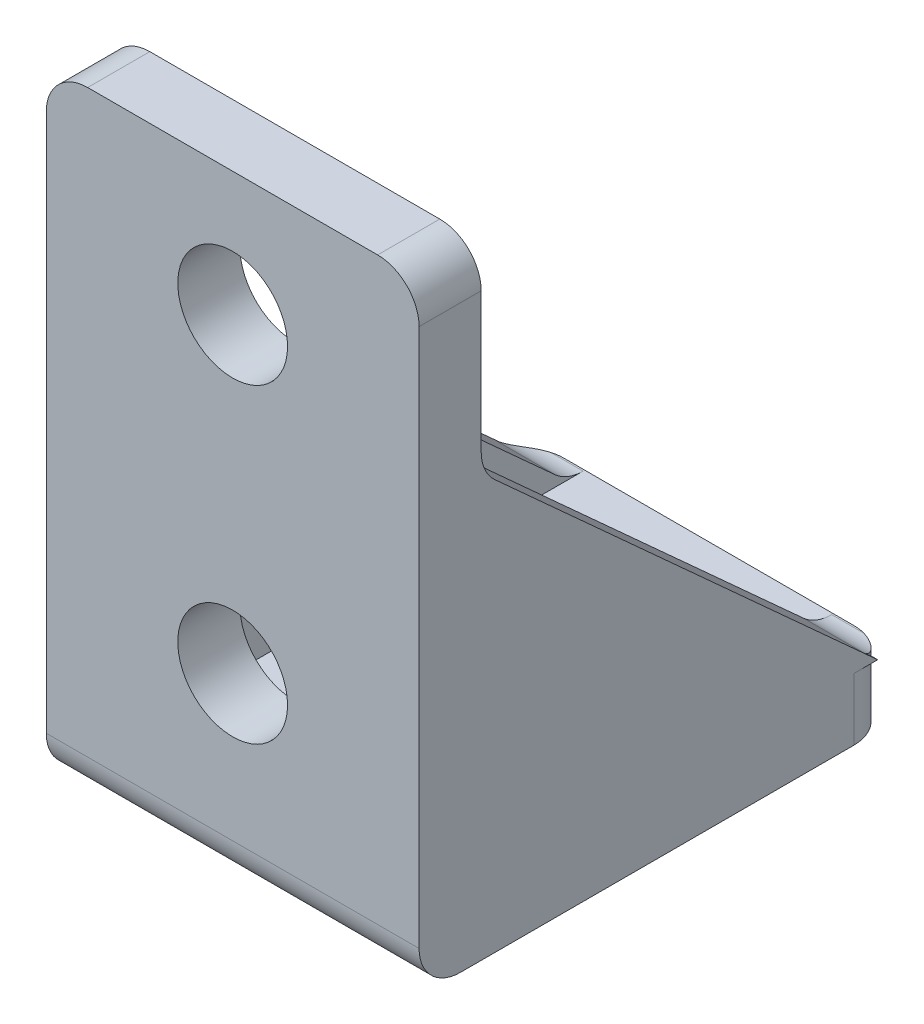
ISO-10303-21;
HEADER;
FILE_DESCRIPTION(('STEP AP214'),'2;1');
FILE_NAME('part.step','',(''),(''),'','','');
FILE_SCHEMA(('AUTOMOTIVE_DESIGN { 1 0 10303 214 1 1 1 1 }'));
ENDSEC;
DATA;
#1=APPLICATION_CONTEXT('core data for automotive mechanical design processes');
#2=APPLICATION_PROTOCOL_DEFINITION('international standard','automotive_design',2000,#1);
#3=PRODUCT_CONTEXT('',#1,'mechanical');
#4=PRODUCT('Part','Part','',(#3));
#5=PRODUCT_RELATED_PRODUCT_CATEGORY('part','',(#4));
#6=PRODUCT_DEFINITION_FORMATION('','',#4);
#7=PRODUCT_DEFINITION_CONTEXT('part definition',#1,'design');
#8=PRODUCT_DEFINITION('design','',#6,#7);
#9=PRODUCT_DEFINITION_SHAPE('','',#8);
#10=(LENGTH_UNIT() NAMED_UNIT(*) SI_UNIT(.MILLI.,.METRE.));
#11=(NAMED_UNIT(*) PLANE_ANGLE_UNIT() SI_UNIT($,.RADIAN.));
#12=(NAMED_UNIT(*) SI_UNIT($,.STERADIAN.) SOLID_ANGLE_UNIT());
#13=UNCERTAINTY_MEASURE_WITH_UNIT(LENGTH_MEASURE(1.E-05),#10,'distance_accuracy_value','');
#14=(GEOMETRIC_REPRESENTATION_CONTEXT(3) GLOBAL_UNCERTAINTY_ASSIGNED_CONTEXT((#13)) GLOBAL_UNIT_ASSIGNED_CONTEXT((#10,
#11,#12)) REPRESENTATION_CONTEXT('',''));
#15=CARTESIAN_POINT('',(0.,0.,0.));
#16=DIRECTION('',(0.,0.,1.));
#17=DIRECTION('',(1.,0.,0.));
#18=AXIS2_PLACEMENT_3D('',#15,#16,#17);
#19=CARTESIAN_POINT('',(0.,0.,0.));
#20=DIRECTION('',(0.,0.,1.));
#21=DIRECTION('',(1.,0.,0.));
#22=AXIS2_PLACEMENT_3D('',#19,#20,#21);
#23=PLANE('',#22);
#24=CARTESIAN_POINT('',(9.,-21.,0.));
#25=DIRECTION('',(0.,0.,1.));
#26=DIRECTION('',(1.,0.,0.));
#27=AXIS2_PLACEMENT_3D('',#24,#25,#26);
#28=CIRCLE('',#27,2.65);
#29=CARTESIAN_POINT('',(11.65,-21.,0.));
#30=VERTEX_POINT('',#29);
#31=EDGE_CURVE('E288',#30,#30,#28,.T.);
#32=ORIENTED_EDGE('',*,*,#31,.T.);
#33=EDGE_LOOP('',(#32));
#34=FACE_BOUND('',#33,.T.);
#35=CARTESIAN_POINT('',(9.,-6.,0.));
#36=DIRECTION('',(0.,0.,1.));
#37=DIRECTION('',(1.,0.,0.));
#38=AXIS2_PLACEMENT_3D('',#35,#36,#37);
#39=CIRCLE('',#38,2.65);
#40=CARTESIAN_POINT('',(11.65,-6.,0.));
#41=VERTEX_POINT('',#40);
#42=EDGE_CURVE('E295',#41,#41,#39,.T.);
#43=ORIENTED_EDGE('',*,*,#42,.T.);
#44=EDGE_LOOP('',(#43));
#45=FACE_BOUND('',#44,.T.);
#46=DIRECTION('',(0.,1.,0.));
#47=VECTOR('',#46,1.);
#48=CARTESIAN_POINT('',(3.,-9.62851294118363,0.));
#49=LINE('',#48,#47);
#50=CARTESIAN_POINT('',(3.,-27.,0.));
#51=VERTEX_POINT('',#50);
#52=CARTESIAN_POINT('',(3.,-8.74260656438226,0.));
#53=VERTEX_POINT('',#52);
#54=EDGE_CURVE('E65',#51,#53,#49,.T.);
#55=ORIENTED_EDGE('',*,*,#54,.T.);
#56=DIRECTION('',(-1.,0.,0.));
#57=VECTOR('',#56,1.);
#58=CARTESIAN_POINT('',(0.,-8.74260656438226,0.));
#59=LINE('',#58,#57);
#60=CARTESIAN_POINT('',(0.,-8.74260656438226,0.));
#61=VERTEX_POINT('',#60);
#62=EDGE_CURVE('E392',#53,#61,#59,.T.);
#63=ORIENTED_EDGE('',*,*,#62,.T.);
#64=DIRECTION('',(0.,-1.,0.));
#65=VECTOR('',#64,1.);
#66=CARTESIAN_POINT('',(0.,0.,0.));
#67=LINE('',#66,#65);
#68=CARTESIAN_POINT('',(0.,-2.,0.));
#69=VERTEX_POINT('',#68);
#70=EDGE_CURVE('E302',#69,#61,#67,.T.);
#71=ORIENTED_EDGE('',*,*,#70,.F.);
#72=CARTESIAN_POINT('',(2.,-2.,0.));
#73=DIRECTION('',(0.,0.,1.));
#74=DIRECTION('',(1.,0.,0.));
#75=AXIS2_PLACEMENT_3D('',#72,#73,#74);
#76=CIRCLE('',#75,2.);
#77=CARTESIAN_POINT('',(2.,0.,0.));
#78=VERTEX_POINT('',#77);
#79=EDGE_CURVE('E355',#69,#78,#76,.F.);
#80=ORIENTED_EDGE('',*,*,#79,.T.);
#81=DIRECTION('',(-1.,0.,0.));
#82=VECTOR('',#81,1.);
#83=CARTESIAN_POINT('',(0.,0.,0.));
#84=LINE('',#83,#82);
#85=CARTESIAN_POINT('',(16.,0.,0.));
#86=VERTEX_POINT('',#85);
#87=EDGE_CURVE('E306',#86,#78,#84,.T.);
#88=ORIENTED_EDGE('',*,*,#87,.F.);
#89=CARTESIAN_POINT('',(16.,-2.,0.));
#90=DIRECTION('',(0.,0.,1.));
#91=DIRECTION('',(1.,0.,0.));
#92=AXIS2_PLACEMENT_3D('',#89,#90,#91);
#93=CIRCLE('',#92,2.);
#94=CARTESIAN_POINT('',(18.,-2.,0.));
#95=VERTEX_POINT('',#94);
#96=EDGE_CURVE('E347',#86,#95,#93,.F.);
#97=ORIENTED_EDGE('',*,*,#96,.T.);
#98=DIRECTION('',(0.,1.,0.));
#99=VECTOR('',#98,1.);
#100=CARTESIAN_POINT('',(18.,0.,0.));
#101=LINE('',#100,#99);
#102=CARTESIAN_POINT('',(18.,-8.74260656438226,0.));
#103=VERTEX_POINT('',#102);
#104=EDGE_CURVE('E316',#103,#95,#101,.T.);
#105=ORIENTED_EDGE('',*,*,#104,.F.);
#106=DIRECTION('',(1.,0.,0.));
#107=VECTOR('',#106,1.);
#108=CARTESIAN_POINT('',(0.,-8.74260656438226,0.));
#109=LINE('',#108,#107);
#110=CARTESIAN_POINT('',(15.,-8.74260656438227,0.));
#111=VERTEX_POINT('',#110);
#112=EDGE_CURVE('E388',#103,#111,#109,.F.);
#113=ORIENTED_EDGE('',*,*,#112,.T.);
#114=DIRECTION('',(0.,-1.,0.));
#115=VECTOR('',#114,1.);
#116=CARTESIAN_POINT('',(15.,-27.,0.));
#117=LINE('',#116,#115);
#118=CARTESIAN_POINT('',(15.,-27.,0.));
#119=VERTEX_POINT('',#118);
#120=EDGE_CURVE('E228',#111,#119,#117,.T.);
#121=ORIENTED_EDGE('',*,*,#120,.T.);
#122=DIRECTION('',(-1.,0.,0.));
#123=VECTOR('',#122,1.);
#124=CARTESIAN_POINT('',(0.,-27.,0.));
#125=LINE('',#124,#123);
#126=EDGE_CURVE('E290',#119,#51,#125,.T.);
#127=ORIENTED_EDGE('',*,*,#126,.T.);
#128=EDGE_LOOP('',(#55,#63,#71,#80,#88,#97,#105,#113,#121,#127));
#129=FACE_BOUND('',#128,.T.);
#130=ADVANCED_FACE('F39',(#34,#45,#129),#23,.F.);
#131=CARTESIAN_POINT('',(0.,-27.,0.));
#132=DIRECTION('',(0.,-1.,0.));
#133=DIRECTION('',(0.,0.,-1.));
#134=AXIS2_PLACEMENT_3D('',#131,#132,#133);
#135=PLANE('',#134);
#136=DIRECTION('',(0.,0.,1.));
#137=VECTOR('',#136,1.);
#138=CARTESIAN_POINT('',(10.6,-27.,-6.02510414656997));
#139=LINE('',#138,#137);
#140=CARTESIAN_POINT('',(10.6,-27.,-16.02510414657));
#141=VERTEX_POINT('',#140);
#142=CARTESIAN_POINT('',(10.6,-27.,-6.02510414656997));
#143=VERTEX_POINT('',#142);
#144=EDGE_CURVE('E265',#141,#143,#139,.T.);
#145=ORIENTED_EDGE('',*,*,#144,.T.);
#146=CARTESIAN_POINT('',(8.99999999999999,-27.,-6.02510414656997));
#147=DIRECTION('',(0.,-1.,0.));
#148=DIRECTION('',(0.,0.,-1.));
#149=AXIS2_PLACEMENT_3D('',#146,#147,#148);
#150=CIRCLE('',#149,1.6);
#151=CARTESIAN_POINT('',(7.39999999999999,-27.,-6.02510414656997));
#152=VERTEX_POINT('',#151);
#153=EDGE_CURVE('E255',#143,#152,#150,.T.);
#154=ORIENTED_EDGE('',*,*,#153,.T.);
#155=DIRECTION('',(0.,0.,-1.));
#156=VECTOR('',#155,1.);
#157=CARTESIAN_POINT('',(7.39999999999999,-27.,-6.02510414656997));
#158=LINE('',#157,#156);
#159=CARTESIAN_POINT('',(7.39999999999999,-27.,-16.02510414657));
#160=VERTEX_POINT('',#159);
#161=EDGE_CURVE('E253',#152,#160,#158,.T.);
#162=ORIENTED_EDGE('',*,*,#161,.T.);
#163=CARTESIAN_POINT('',(8.99999999999998,-27.,-16.02510414657));
#164=DIRECTION('',(0.,-1.,0.));
#165=DIRECTION('',(0.,0.,-1.));
#166=AXIS2_PLACEMENT_3D('',#163,#164,#165);
#167=CIRCLE('',#166,1.6);
#168=EDGE_CURVE('E260',#160,#141,#167,.T.);
#169=ORIENTED_EDGE('',*,*,#168,.T.);
#170=EDGE_LOOP('',(#145,#154,#162,#169));
#171=FACE_BOUND('',#170,.T.);
#172=DIRECTION('',(0.,0.,-1.));
#173=VECTOR('',#172,1.);
#174=CARTESIAN_POINT('',(15.,-27.,-19.146125));
#175=LINE('',#174,#173);
#176=CARTESIAN_POINT('',(15.,-27.,-19.918217699995));
#177=VERTEX_POINT('',#176);
#178=EDGE_CURVE('E231',#119,#177,#175,.T.);
#179=ORIENTED_EDGE('',*,*,#178,.T.);
#180=DIRECTION('',(1.,0.,0.));
#181=VECTOR('',#180,1.);
#182=CARTESIAN_POINT('',(0.,-27.,-19.918217699995));
#183=LINE('',#182,#181);
#184=CARTESIAN_POINT('',(16.5660749556605,-27.,-19.918217699995));
#185=VERTEX_POINT('',#184);
#186=EDGE_CURVE('E372',#177,#185,#183,.T.);
#187=ORIENTED_EDGE('',*,*,#186,.T.);
#188=CARTESIAN_POINT('',(16.,-27.,-18.));
#189=DIRECTION('',(0.,-1.,0.));
#190=DIRECTION('',(0.,0.,-1.));
#191=AXIS2_PLACEMENT_3D('',#188,#189,#190);
#192=CIRCLE('',#191,2.);
#193=CARTESIAN_POINT('',(16.,-27.,-20.));
#194=VERTEX_POINT('',#193);
#195=EDGE_CURVE('E341',#185,#194,#192,.F.);
#196=ORIENTED_EDGE('',*,*,#195,.T.);
#197=DIRECTION('',(1.,0.,0.));
#198=VECTOR('',#197,1.);
#199=CARTESIAN_POINT('',(0.,-27.,-20.));
#200=LINE('',#199,#198);
#201=CARTESIAN_POINT('',(2.,-27.,-20.));
#202=VERTEX_POINT('',#201);
#203=EDGE_CURVE('E281',#202,#194,#200,.T.);
#204=ORIENTED_EDGE('',*,*,#203,.F.);
#205=CARTESIAN_POINT('',(2.,-27.,-18.));
#206=DIRECTION('',(0.,-1.,0.));
#207=DIRECTION('',(0.,0.,-1.));
#208=AXIS2_PLACEMENT_3D('',#205,#206,#207);
#209=CIRCLE('',#208,2.);
#210=CARTESIAN_POINT('',(1.43392504433951,-27.,-19.918217699995));
#211=VERTEX_POINT('',#210);
#212=EDGE_CURVE('E336',#202,#211,#209,.F.);
#213=ORIENTED_EDGE('',*,*,#212,.T.);
#214=DIRECTION('',(-1.,0.,0.));
#215=VECTOR('',#214,1.);
#216=CARTESIAN_POINT('',(0.,-27.,-19.918217699995));
#217=LINE('',#216,#215);
#218=CARTESIAN_POINT('',(3.,-27.,-19.918217699995));
#219=VERTEX_POINT('',#218);
#220=EDGE_CURVE('E375',#211,#219,#217,.F.);
#221=ORIENTED_EDGE('',*,*,#220,.T.);
#222=DIRECTION('',(0.,0.,1.));
#223=VECTOR('',#222,1.);
#224=CARTESIAN_POINT('',(3.,-27.,0.));
#225=LINE('',#224,#223);
#226=EDGE_CURVE('E242',#219,#51,#225,.T.);
#227=ORIENTED_EDGE('',*,*,#226,.T.);
#228=ORIENTED_EDGE('',*,*,#126,.F.);
#229=EDGE_LOOP('',(#179,#187,#196,#204,#213,#221,#227,#228));
#230=FACE_BOUND('',#229,.T.);
#231=ADVANCED_FACE('F443',(#171,#230),#135,.F.);
#232=CARTESIAN_POINT('',(0.,0.,3.));
#233=DIRECTION('',(0.,0.,1.));
#234=DIRECTION('',(1.,0.,0.));
#235=AXIS2_PLACEMENT_3D('',#232,#233,#234);
#236=PLANE('',#235);
#237=CARTESIAN_POINT('',(9.,-6.,3.));
#238=DIRECTION('',(0.,0.,1.));
#239=DIRECTION('',(1.,0.,0.));
#240=AXIS2_PLACEMENT_3D('',#237,#238,#239);
#241=CIRCLE('',#240,2.65);
#242=CARTESIAN_POINT('',(11.65,-6.,3.));
#243=VERTEX_POINT('',#242);
#244=EDGE_CURVE('E296',#243,#243,#241,.T.);
#245=ORIENTED_EDGE('',*,*,#244,.F.);
#246=EDGE_LOOP('',(#245));
#247=FACE_BOUND('',#246,.T.);
#248=DIRECTION('',(0.,-1.,0.));
#249=VECTOR('',#248,1.);
#250=CARTESIAN_POINT('',(0.,0.,3.));
#251=LINE('',#250,#249);
#252=CARTESIAN_POINT('',(0.,-2.,3.));
#253=VERTEX_POINT('',#252);
#254=CARTESIAN_POINT('',(0.,-28.,3.));
#255=VERTEX_POINT('',#254);
#256=EDGE_CURVE('E301',#253,#255,#251,.T.);
#257=ORIENTED_EDGE('',*,*,#256,.T.);
#258=DIRECTION('',(1.,0.,0.));
#259=VECTOR('',#258,1.);
#260=CARTESIAN_POINT('',(18.,-28.,3.));
#261=LINE('',#260,#259);
#262=CARTESIAN_POINT('',(18.,-28.,3.));
#263=VERTEX_POINT('',#262);
#264=EDGE_CURVE('E362',#255,#263,#261,.T.);
#265=ORIENTED_EDGE('',*,*,#264,.T.);
#266=DIRECTION('',(0.,1.,0.));
#267=VECTOR('',#266,1.);
#268=CARTESIAN_POINT('',(18.,0.,3.));
#269=LINE('',#268,#267);
#270=CARTESIAN_POINT('',(18.,-2.,3.));
#271=VERTEX_POINT('',#270);
#272=EDGE_CURVE('E310',#263,#271,#269,.T.);
#273=ORIENTED_EDGE('',*,*,#272,.T.);
#274=CARTESIAN_POINT('',(16.,-2.,3.));
#275=DIRECTION('',(0.,0.,1.));
#276=DIRECTION('',(1.,0.,0.));
#277=AXIS2_PLACEMENT_3D('',#274,#275,#276);
#278=CIRCLE('',#277,2.);
#279=CARTESIAN_POINT('',(16.,0.,3.));
#280=VERTEX_POINT('',#279);
#281=EDGE_CURVE('E356',#271,#280,#278,.T.);
#282=ORIENTED_EDGE('',*,*,#281,.T.);
#283=DIRECTION('',(-1.,0.,0.));
#284=VECTOR('',#283,1.);
#285=CARTESIAN_POINT('',(0.,0.,3.));
#286=LINE('',#285,#284);
#287=CARTESIAN_POINT('',(2.,0.,3.));
#288=VERTEX_POINT('',#287);
#289=EDGE_CURVE('E308',#280,#288,#286,.T.);
#290=ORIENTED_EDGE('',*,*,#289,.T.);
#291=CARTESIAN_POINT('',(2.,-2.,3.));
#292=DIRECTION('',(0.,0.,1.));
#293=DIRECTION('',(1.,0.,0.));
#294=AXIS2_PLACEMENT_3D('',#291,#292,#293);
#295=CIRCLE('',#294,2.);
#296=EDGE_CURVE('E361',#288,#253,#295,.T.);
#297=ORIENTED_EDGE('',*,*,#296,.T.);
#298=EDGE_LOOP('',(#257,#265,#273,#282,#290,#297));
#299=FACE_BOUND('',#298,.T.);
#300=CARTESIAN_POINT('',(9.,-21.,3.));
#301=DIRECTION('',(0.,0.,1.));
#302=DIRECTION('',(1.,0.,0.));
#303=AXIS2_PLACEMENT_3D('',#300,#301,#302);
#304=CIRCLE('',#303,2.65);
#305=CARTESIAN_POINT('',(11.65,-21.,3.));
#306=VERTEX_POINT('',#305);
#307=EDGE_CURVE('E292',#306,#306,#304,.T.);
#308=ORIENTED_EDGE('',*,*,#307,.F.);
#309=EDGE_LOOP('',(#308));
#310=FACE_BOUND('',#309,.T.);
#311=ADVANCED_FACE('F452',(#247,#299,#310),#236,.T.);
#312=CARTESIAN_POINT('',(0.,0.,3.));
#313=DIRECTION('',(1.,0.,0.));
#314=DIRECTION('',(0.,1.,0.));
#315=AXIS2_PLACEMENT_3D('',#312,#313,#314);
#316=PLANE('',#315);
#317=DIRECTION('',(0.,0.,-1.));
#318=VECTOR('',#317,1.);
#319=CARTESIAN_POINT('',(0.,-30.,3.));
#320=LINE('',#319,#318);
#321=CARTESIAN_POINT('',(0.,-30.,1.));
#322=VERTEX_POINT('',#321);
#323=CARTESIAN_POINT('',(0.,-30.,-18.));
#324=VERTEX_POINT('',#323);
#325=EDGE_CURVE('E323',#322,#324,#320,.T.);
#326=ORIENTED_EDGE('',*,*,#325,.F.);
#327=CARTESIAN_POINT('',(0.,-28.,1.));
#328=DIRECTION('',(1.,0.,0.));
#329=DIRECTION('',(0.,1.,0.));
#330=AXIS2_PLACEMENT_3D('',#327,#328,#329);
#331=CIRCLE('',#330,2.);
#332=EDGE_CURVE('E370',#322,#255,#331,.F.);
#333=ORIENTED_EDGE('',*,*,#332,.T.);
#334=ORIENTED_EDGE('',*,*,#256,.F.);
#335=DIRECTION('',(0.,0.,-1.));
#336=VECTOR('',#335,1.);
#337=CARTESIAN_POINT('',(0.,-2.,3.));
#338=LINE('',#337,#336);
#339=EDGE_CURVE('E343',#253,#69,#338,.T.);
#340=ORIENTED_EDGE('',*,*,#339,.T.);
#341=ORIENTED_EDGE('',*,*,#70,.T.);
#342=CARTESIAN_POINT('',(0.,-8.74260656438226,-2.));
#343=DIRECTION('',(1.,0.,0.));
#344=DIRECTION('',(0.,1.,0.));
#345=AXIS2_PLACEMENT_3D('',#342,#343,#344);
#346=CIRCLE('',#345,2.);
#347=CARTESIAN_POINT('',(0.,-10.2237983420974,-0.656098620571822));
#348=VERTEX_POINT('',#347);
#349=EDGE_CURVE('E548',#61,#348,#346,.T.);
#350=ORIENTED_EDGE('',*,*,#349,.T.);
#351=DIRECTION('',(0.,-0.67195068971409,-0.740595888857587));
#352=VECTOR('',#351,1.);
#353=CARTESIAN_POINT('',(0.,-9.62851294118363,0.));
#354=LINE('',#353,#352);
#355=CARTESIAN_POINT('',(0.,-27.,-19.146125));
#356=VERTEX_POINT('',#355);
#357=EDGE_CURVE('E213',#348,#356,#354,.T.);
#358=ORIENTED_EDGE('',*,*,#357,.T.);
#359=DIRECTION('',(0.,0.,1.));
#360=VECTOR('',#359,1.);
#361=CARTESIAN_POINT('',(0.,-27.,0.));
#362=LINE('',#361,#360);
#363=CARTESIAN_POINT('',(0.,-27.,-18.));
#364=VERTEX_POINT('',#363);
#365=EDGE_CURVE('E238',#356,#364,#362,.T.);
#366=ORIENTED_EDGE('',*,*,#365,.T.);
#367=DIRECTION('',(0.,-1.,0.));
#368=VECTOR('',#367,1.);
#369=CARTESIAN_POINT('',(0.,-30.,-18.));
#370=LINE('',#369,#368);
#371=EDGE_CURVE('E346',#364,#324,#370,.T.);
#372=ORIENTED_EDGE('',*,*,#371,.T.);
#373=EDGE_LOOP('',(#326,#333,#334,#340,#341,#350,#358,#366,#372));
#374=FACE_BOUND('',#373,.T.);
#375=ADVANCED_FACE('F412',(#374),#316,.F.);
#376=CARTESIAN_POINT('',(0.,-30.,3.));
#377=DIRECTION('',(0.,1.,0.));
#378=DIRECTION('',(0.,0.,1.));
#379=AXIS2_PLACEMENT_3D('',#376,#377,#378);
#380=PLANE('',#379);
#381=DIRECTION('',(0.,0.,-1.));
#382=VECTOR('',#381,1.);
#383=CARTESIAN_POINT('',(18.,-30.,3.));
#384=LINE('',#383,#382);
#385=CARTESIAN_POINT('',(18.,-30.,1.));
#386=VERTEX_POINT('',#385);
#387=CARTESIAN_POINT('',(18.,-30.,-18.));
#388=VERTEX_POINT('',#387);
#389=EDGE_CURVE('E312',#386,#388,#384,.T.);
#390=ORIENTED_EDGE('',*,*,#389,.F.);
#391=DIRECTION('',(1.,0.,0.));
#392=VECTOR('',#391,1.);
#393=CARTESIAN_POINT('',(0.,-30.,1.));
#394=LINE('',#393,#392);
#395=EDGE_CURVE('E369',#386,#322,#394,.F.);
#396=ORIENTED_EDGE('',*,*,#395,.T.);
#397=ORIENTED_EDGE('',*,*,#325,.T.);
#398=CARTESIAN_POINT('',(2.,-30.,-18.));
#399=DIRECTION('',(0.,1.,0.));
#400=DIRECTION('',(0.,0.,1.));
#401=AXIS2_PLACEMENT_3D('',#398,#399,#400);
#402=CIRCLE('',#401,2.);
#403=CARTESIAN_POINT('',(2.,-30.,-20.));
#404=VERTEX_POINT('',#403);
#405=EDGE_CURVE('E329',#324,#404,#402,.F.);
#406=ORIENTED_EDGE('',*,*,#405,.T.);
#407=DIRECTION('',(1.,0.,0.));
#408=VECTOR('',#407,1.);
#409=CARTESIAN_POINT('',(0.,-30.,-20.));
#410=LINE('',#409,#408);
#411=CARTESIAN_POINT('',(16.,-30.,-20.));
#412=VERTEX_POINT('',#411);
#413=EDGE_CURVE('E280',#404,#412,#410,.T.);
#414=ORIENTED_EDGE('',*,*,#413,.T.);
#415=CARTESIAN_POINT('',(16.,-30.,-18.));
#416=DIRECTION('',(0.,1.,0.));
#417=DIRECTION('',(0.,0.,1.));
#418=AXIS2_PLACEMENT_3D('',#415,#416,#417);
#419=CIRCLE('',#418,2.);
#420=EDGE_CURVE('E328',#412,#388,#419,.F.);
#421=ORIENTED_EDGE('',*,*,#420,.T.);
#422=EDGE_LOOP('',(#390,#396,#397,#406,#414,#421));
#423=FACE_BOUND('',#422,.T.);
#424=CARTESIAN_POINT('',(8.99999999999999,-30.,-6.02510414656997));
#425=DIRECTION('',(0.,-1.,0.));
#426=DIRECTION('',(0.,0.,-1.));
#427=AXIS2_PLACEMENT_3D('',#424,#425,#426);
#428=CIRCLE('',#427,1.6);
#429=CARTESIAN_POINT('',(10.6,-30.,-6.02510414656997));
#430=VERTEX_POINT('',#429);
#431=CARTESIAN_POINT('',(7.39999999999999,-30.,-6.02510414656997));
#432=VERTEX_POINT('',#431);
#433=EDGE_CURVE('E252',#430,#432,#428,.T.);
#434=ORIENTED_EDGE('',*,*,#433,.F.);
#435=DIRECTION('',(0.,0.,1.));
#436=VECTOR('',#435,1.);
#437=CARTESIAN_POINT('',(10.6,-30.,-6.02510414656997));
#438=LINE('',#437,#436);
#439=CARTESIAN_POINT('',(10.6,-30.,-16.02510414657));
#440=VERTEX_POINT('',#439);
#441=EDGE_CURVE('E258',#440,#430,#438,.T.);
#442=ORIENTED_EDGE('',*,*,#441,.F.);
#443=CARTESIAN_POINT('',(8.99999999999998,-30.,-16.02510414657));
#444=DIRECTION('',(0.,-1.,0.));
#445=DIRECTION('',(0.,0.,-1.));
#446=AXIS2_PLACEMENT_3D('',#443,#444,#445);
#447=CIRCLE('',#446,1.6);
#448=CARTESIAN_POINT('',(7.39999999999998,-30.,-16.02510414657));
#449=VERTEX_POINT('',#448);
#450=EDGE_CURVE('E269',#449,#440,#447,.T.);
#451=ORIENTED_EDGE('',*,*,#450,.F.);
#452=DIRECTION('',(0.,0.,-1.));
#453=VECTOR('',#452,1.);
#454=CARTESIAN_POINT('',(7.39999999999999,-30.,-6.02510414656997));
#455=LINE('',#454,#453);
#456=EDGE_CURVE('E270',#432,#449,#455,.T.);
#457=ORIENTED_EDGE('',*,*,#456,.F.);
#458=EDGE_LOOP('',(#434,#442,#451,#457));
#459=FACE_BOUND('',#458,.T.);
#460=ADVANCED_FACE('F463',(#423,#459),#380,.F.);
#461=CARTESIAN_POINT('',(18.,0.,3.));
#462=DIRECTION('',(-1.,0.,0.));
#463=DIRECTION('',(0.,-1.,0.));
#464=AXIS2_PLACEMENT_3D('',#461,#462,#463);
#465=PLANE('',#464);
#466=ORIENTED_EDGE('',*,*,#272,.F.);
#467=CARTESIAN_POINT('',(18.,-28.,1.));
#468=DIRECTION('',(-1.,0.,0.));
#469=DIRECTION('',(0.,-1.,0.));
#470=AXIS2_PLACEMENT_3D('',#467,#468,#469);
#471=CIRCLE('',#470,2.);
#472=EDGE_CURVE('E366',#263,#386,#471,.F.);
#473=ORIENTED_EDGE('',*,*,#472,.T.);
#474=ORIENTED_EDGE('',*,*,#389,.T.);
#475=DIRECTION('',(0.,-1.,0.));
#476=VECTOR('',#475,1.);
#477=CARTESIAN_POINT('',(18.,-27.,-18.));
#478=LINE('',#477,#476);
#479=CARTESIAN_POINT('',(18.,-27.,-18.));
#480=VERTEX_POINT('',#479);
#481=EDGE_CURVE('E221',#388,#480,#478,.F.);
#482=ORIENTED_EDGE('',*,*,#481,.T.);
#483=DIRECTION('',(0.,0.,-1.));
#484=VECTOR('',#483,1.);
#485=CARTESIAN_POINT('',(18.,-27.,-19.146125));
#486=LINE('',#485,#484);
#487=CARTESIAN_POINT('',(18.,-27.,-19.146125));
#488=VERTEX_POINT('',#487);
#489=EDGE_CURVE('E206',#480,#488,#486,.T.);
#490=ORIENTED_EDGE('',*,*,#489,.T.);
#491=DIRECTION('',(0.,0.67195068971409,0.740595888857587));
#492=VECTOR('',#491,1.);
#493=CARTESIAN_POINT('',(18.,-9.62851294118363,0.));
#494=LINE('',#493,#492);
#495=CARTESIAN_POINT('',(18.,-10.2237983420974,-0.65609862057182));
#496=VERTEX_POINT('',#495);
#497=EDGE_CURVE('E223',#488,#496,#494,.T.);
#498=ORIENTED_EDGE('',*,*,#497,.T.);
#499=CARTESIAN_POINT('',(18.,-8.74260656438226,-2.));
#500=DIRECTION('',(-1.,0.,0.));
#501=DIRECTION('',(0.,-1.,0.));
#502=AXIS2_PLACEMENT_3D('',#499,#500,#501);
#503=CIRCLE('',#502,2.);
#504=EDGE_CURVE('E50',#496,#103,#503,.T.);
#505=ORIENTED_EDGE('',*,*,#504,.T.);
#506=ORIENTED_EDGE('',*,*,#104,.T.);
#507=DIRECTION('',(0.,0.,-1.));
#508=VECTOR('',#507,1.);
#509=CARTESIAN_POINT('',(18.,-2.,3.));
#510=LINE('',#509,#508);
#511=EDGE_CURVE('E331',#95,#271,#510,.F.);
#512=ORIENTED_EDGE('',*,*,#511,.T.);
#513=EDGE_LOOP('',(#466,#473,#474,#482,#490,#498,#505,#506,#512));
#514=FACE_BOUND('',#513,.T.);
#515=ADVANCED_FACE('F220',(#514),#465,.F.);
#516=CARTESIAN_POINT('',(0.,0.,3.));
#517=DIRECTION('',(0.,-1.,0.));
#518=DIRECTION('',(0.,0.,-1.));
#519=AXIS2_PLACEMENT_3D('',#516,#517,#518);
#520=PLANE('',#519);
#521=ORIENTED_EDGE('',*,*,#87,.T.);
#522=DIRECTION('',(0.,0.,-1.));
#523=VECTOR('',#522,1.);
#524=CARTESIAN_POINT('',(2.,0.,3.));
#525=LINE('',#524,#523);
#526=EDGE_CURVE('E360',#78,#288,#525,.F.);
#527=ORIENTED_EDGE('',*,*,#526,.T.);
#528=ORIENTED_EDGE('',*,*,#289,.F.);
#529=DIRECTION('',(0.,0.,-1.));
#530=VECTOR('',#529,1.);
#531=CARTESIAN_POINT('',(16.,0.,3.));
#532=LINE('',#531,#530);
#533=EDGE_CURVE('E353',#280,#86,#532,.T.);
#534=ORIENTED_EDGE('',*,*,#533,.T.);
#535=EDGE_LOOP('',(#521,#527,#528,#534));
#536=FACE_BOUND('',#535,.T.);
#537=ADVANCED_FACE('F456',(#536),#520,.F.);
#538=CARTESIAN_POINT('',(9.,-6.,3.));
#539=DIRECTION('',(0.,0.,-1.));
#540=DIRECTION('',(-1.,0.,0.));
#541=AXIS2_PLACEMENT_3D('',#538,#539,#540);
#542=CYLINDRICAL_SURFACE('',#541,2.65);
#543=ORIENTED_EDGE('',*,*,#244,.T.);
#544=EDGE_LOOP('',(#543));
#545=FACE_BOUND('',#544,.T.);
#546=ORIENTED_EDGE('',*,*,#42,.F.);
#547=EDGE_LOOP('',(#546));
#548=FACE_BOUND('',#547,.T.);
#549=ADVANCED_FACE('F461',(#545,#548),#542,.F.);
#550=CARTESIAN_POINT('',(9.,-21.,3.));
#551=DIRECTION('',(0.,0.,-1.));
#552=DIRECTION('',(-1.,0.,0.));
#553=AXIS2_PLACEMENT_3D('',#550,#551,#552);
#554=CYLINDRICAL_SURFACE('',#553,2.65);
#555=ORIENTED_EDGE('',*,*,#307,.T.);
#556=EDGE_LOOP('',(#555));
#557=FACE_BOUND('',#556,.T.);
#558=ORIENTED_EDGE('',*,*,#31,.F.);
#559=EDGE_LOOP('',(#558));
#560=FACE_BOUND('',#559,.T.);
#561=ADVANCED_FACE('F504',(#557,#560),#554,.F.);
#562=CARTESIAN_POINT('',(0.,-27.,-20.));
#563=DIRECTION('',(0.,0.,-1.));
#564=DIRECTION('',(-1.,0.,0.));
#565=AXIS2_PLACEMENT_3D('',#562,#563,#564);
#566=PLANE('',#565);
#567=ORIENTED_EDGE('',*,*,#203,.T.);
#568=DIRECTION('',(0.,-1.,0.));
#569=VECTOR('',#568,1.);
#570=CARTESIAN_POINT('',(16.,-30.,-20.));
#571=LINE('',#570,#569);
#572=EDGE_CURVE('E322',#194,#412,#571,.T.);
#573=ORIENTED_EDGE('',*,*,#572,.T.);
#574=ORIENTED_EDGE('',*,*,#413,.F.);
#575=DIRECTION('',(0.,-1.,0.));
#576=VECTOR('',#575,1.);
#577=CARTESIAN_POINT('',(2.,-27.,-20.));
#578=LINE('',#577,#576);
#579=EDGE_CURVE('E321',#404,#202,#578,.F.);
#580=ORIENTED_EDGE('',*,*,#579,.T.);
#581=EDGE_LOOP('',(#567,#573,#574,#580));
#582=FACE_BOUND('',#581,.T.);
#583=ADVANCED_FACE('F501',(#582),#566,.T.);
#584=CARTESIAN_POINT('',(8.99999999999999,-27.,-6.02510414656997));
#585=DIRECTION('',(0.,-1.,0.));
#586=DIRECTION('',(0.,0.,-1.));
#587=AXIS2_PLACEMENT_3D('',#584,#585,#586);
#588=CYLINDRICAL_SURFACE('',#587,1.6);
#589=ORIENTED_EDGE('',*,*,#433,.T.);
#590=DIRECTION('',(0.,-1.,0.));
#591=VECTOR('',#590,1.);
#592=CARTESIAN_POINT('',(7.39999999999999,-27.,-6.02510414656997));
#593=LINE('',#592,#591);
#594=EDGE_CURVE('E262',#152,#432,#593,.T.);
#595=ORIENTED_EDGE('',*,*,#594,.F.);
#596=ORIENTED_EDGE('',*,*,#153,.F.);
#597=DIRECTION('',(0.,-1.,0.));
#598=VECTOR('',#597,1.);
#599=CARTESIAN_POINT('',(10.6,-27.,-6.02510414656997));
#600=LINE('',#599,#598);
#601=EDGE_CURVE('E274',#143,#430,#600,.T.);
#602=ORIENTED_EDGE('',*,*,#601,.T.);
#603=EDGE_LOOP('',(#589,#595,#596,#602));
#604=FACE_BOUND('',#603,.T.);
#605=ADVANCED_FACE('F476',(#604),#588,.F.);
#606=CARTESIAN_POINT('',(10.6,-27.,-6.02510414656997));
#607=DIRECTION('',(1.,0.,0.));
#608=DIRECTION('',(0.,0.,-1.));
#609=AXIS2_PLACEMENT_3D('',#606,#607,#608);
#610=PLANE('',#609);
#611=ORIENTED_EDGE('',*,*,#441,.T.);
#612=ORIENTED_EDGE('',*,*,#601,.F.);
#613=ORIENTED_EDGE('',*,*,#144,.F.);
#614=DIRECTION('',(0.,-1.,0.));
#615=VECTOR('',#614,1.);
#616=CARTESIAN_POINT('',(10.6,-27.,-16.02510414657));
#617=LINE('',#616,#615);
#618=EDGE_CURVE('E277',#141,#440,#617,.T.);
#619=ORIENTED_EDGE('',*,*,#618,.T.);
#620=EDGE_LOOP('',(#611,#612,#613,#619));
#621=FACE_BOUND('',#620,.T.);
#622=ADVANCED_FACE('F490',(#621),#610,.F.);
#623=CARTESIAN_POINT('',(8.99999999999998,-27.,-16.02510414657));
#624=DIRECTION('',(0.,-1.,0.));
#625=DIRECTION('',(0.,0.,-1.));
#626=AXIS2_PLACEMENT_3D('',#623,#624,#625);
#627=CYLINDRICAL_SURFACE('',#626,1.6);
#628=ORIENTED_EDGE('',*,*,#450,.T.);
#629=ORIENTED_EDGE('',*,*,#618,.F.);
#630=ORIENTED_EDGE('',*,*,#168,.F.);
#631=DIRECTION('',(0.,-1.,0.));
#632=VECTOR('',#631,1.);
#633=CARTESIAN_POINT('',(7.39999999999998,-27.,-16.02510414657));
#634=LINE('',#633,#632);
#635=EDGE_CURVE('E279',#160,#449,#634,.T.);
#636=ORIENTED_EDGE('',*,*,#635,.T.);
#637=EDGE_LOOP('',(#628,#629,#630,#636));
#638=FACE_BOUND('',#637,.T.);
#639=ADVANCED_FACE('F489',(#638),#627,.F.);
#640=CARTESIAN_POINT('',(7.39999999999999,-27.,-6.02510414656997));
#641=DIRECTION('',(-1.,0.,0.));
#642=DIRECTION('',(0.,0.,1.));
#643=AXIS2_PLACEMENT_3D('',#640,#641,#642);
#644=PLANE('',#643);
#645=ORIENTED_EDGE('',*,*,#456,.T.);
#646=ORIENTED_EDGE('',*,*,#635,.F.);
#647=ORIENTED_EDGE('',*,*,#161,.F.);
#648=ORIENTED_EDGE('',*,*,#594,.T.);
#649=EDGE_LOOP('',(#645,#646,#647,#648));
#650=FACE_BOUND('',#649,.T.);
#651=ADVANCED_FACE('F414',(#650),#644,.F.);
#652=CARTESIAN_POINT('',(16.,-27.,-18.));
#653=DIRECTION('',(0.,1.,0.));
#654=DIRECTION('',(-1.,0.,0.));
#655=AXIS2_PLACEMENT_3D('',#652,#653,#654);
#656=CYLINDRICAL_SURFACE('',#655,2.);
#657=CARTESIAN_POINT('',(17.6390233324682,-27.,-19.146125));
#658=VERTEX_POINT('',#657);
#659=EDGE_CURVE('E211',#480,#658,#192,.F.);
#660=ORIENTED_EDGE('',*,*,#659,.F.);
#661=ORIENTED_EDGE('',*,*,#481,.F.);
#662=ORIENTED_EDGE('',*,*,#420,.F.);
#663=ORIENTED_EDGE('',*,*,#572,.F.);
#664=ORIENTED_EDGE('',*,*,#195,.F.);
#665=CARTESIAN_POINT('',(16.5660749556605,-27.,-19.918217699995));
#666=CARTESIAN_POINT('',(16.6165473500351,-26.9999898498574,-19.9033278232507));
#667=CARTESIAN_POINT('',(16.6664304616377,-26.9998334581675,-19.8864367861532));
#668=CARTESIAN_POINT('',(16.7647219486495,-26.9988855464183,-19.8487744228625));
#669=CARTESIAN_POINT('',(16.8131298259428,-26.9980938142479,-19.8280018025644));
#670=CARTESIAN_POINT('',(16.908413948153,-26.9955247536713,-19.7825780834466));
#671=CARTESIAN_POINT('',(16.9552797746464,-26.993741779096,-19.7579053509114));
#672=CARTESIAN_POINT('',(17.0468385324542,-26.9887768561049,-19.7049723950063));
#673=CARTESIAN_POINT('',(17.0915316928779,-26.9855950555531,-19.6767125510397));
#674=CARTESIAN_POINT('',(17.2221826008386,-26.9732573611803,-19.5866457023281));
#675=CARTESIAN_POINT('',(17.3044506971473,-26.9613113700439,-19.5196762168696));
#676=CARTESIAN_POINT('',(17.4559387886024,-26.9262904186973,-19.3751899475524));
#677=CARTESIAN_POINT('',(17.5252029823075,-26.9032541409846,-19.2977104917346));
#678=CARTESIAN_POINT('',(17.6431972895238,-26.8456717237188,-19.1438713503434));
#679=CARTESIAN_POINT('',(17.6932179660943,-26.8123549587537,-19.0680441276324));
#680=CARTESIAN_POINT('',(17.7802333504846,-26.7327031747261,-18.9156735824289));
#681=CARTESIAN_POINT('',(17.8172296131715,-26.6863697107979,-18.8391303465354));
#682=CARTESIAN_POINT('',(17.861613361555,-26.6106703765353,-18.7318931727839));
#683=CARTESIAN_POINT('',(17.8739743690778,-26.5863486592169,-18.6995456679893));
#684=CARTESIAN_POINT('',(17.8964746162143,-26.5354474530921,-18.6360120747595));
#685=CARTESIAN_POINT('',(17.9066193522791,-26.5088737819751,-18.6048232760307));
#686=CARTESIAN_POINT('',(17.9157663646517,-26.4811917777152,-18.5743163205668));
#687=B_SPLINE_CURVE_WITH_KNOTS('',3,(#665,#666,#667,#668,#669,#670,#671,#672,#673,#674,#675,
#676,#677,#678,#679,#680,#681,#682,#683,#684,#685,#686),.UNSPECIFIED.,.F.,.F.,(4,2,2,2,2,2,2,2,
2,2,4),(0.,0.157828534161503,0.315709781942901,0.474499682350788,0.633272801766732,
0.951676145303344,1.26897686894148,1.55758091714675,1.84615049983019,1.97299039248804,
2.09951205272984),.UNSPECIFIED.);
#688=CARTESIAN_POINT('',(17.9157663646517,-26.4811917777152,-18.5743163205668));
#689=VERTEX_POINT('',#688);
#690=EDGE_CURVE('E393',#185,#689,#687,.T.);
#691=ORIENTED_EDGE('',*,*,#690,.T.);
#692=CARTESIAN_POINT('',(16.,-25.9601083454074,-18.));
#693=DIRECTION('',(0.,0.740595888857587,-0.67195068971409));
#694=DIRECTION('',(0.,0.67195068971409,0.740595888857587));
#695=AXIS2_PLACEMENT_3D('',#692,#693,#694);
#696=ELLIPSE('',#695,2.7005280883818,2.);
#697=EDGE_CURVE('E53',#658,#689,#696,.F.);
#698=ORIENTED_EDGE('',*,*,#697,.F.);
#699=EDGE_LOOP('',(#660,#661,#662,#663,#664,#691,#698));
#700=FACE_BOUND('',#699,.T.);
#701=ADVANCED_FACE('F406',(#700),#656,.T.);
#702=CARTESIAN_POINT('',(2.,0.,-18.));
#703=DIRECTION('',(0.,1.,0.));
#704=DIRECTION('',(-1.,0.,0.));
#705=AXIS2_PLACEMENT_3D('',#702,#703,#704);
#706=CYLINDRICAL_SURFACE('',#705,2.);
#707=ORIENTED_EDGE('',*,*,#212,.F.);
#708=ORIENTED_EDGE('',*,*,#579,.F.);
#709=ORIENTED_EDGE('',*,*,#405,.F.);
#710=ORIENTED_EDGE('',*,*,#371,.F.);
#711=CARTESIAN_POINT('',(0.360976667531856,-27.,-19.146125));
#712=VERTEX_POINT('',#711);
#713=EDGE_CURVE('E340',#712,#364,#209,.F.);
#714=ORIENTED_EDGE('',*,*,#713,.F.);
#715=CARTESIAN_POINT('',(2.,-25.9601083454074,-18.));
#716=DIRECTION('',(0.,0.740595888857587,-0.671950689714089));
#717=DIRECTION('',(0.,0.67195068971409,0.740595888857587));
#718=AXIS2_PLACEMENT_3D('',#715,#716,#717);
#719=ELLIPSE('',#718,2.7005280883818,2.);
#720=CARTESIAN_POINT('',(0.084233635348345,-26.4811917777152,-18.5743163205668));
#721=VERTEX_POINT('',#720);
#722=EDGE_CURVE('E384',#721,#712,#719,.F.);
#723=ORIENTED_EDGE('',*,*,#722,.F.);
#724=CARTESIAN_POINT('',(0.084233635348345,-26.4811917777152,-18.5743163205668));
#725=CARTESIAN_POINT('',(0.0939049202399036,-26.5104939452299,-18.6065957132744));
#726=CARTESIAN_POINT('',(0.104713330100181,-26.5385592531892,-18.6396652166734));
#727=CARTESIAN_POINT('',(0.128788948679402,-26.5920991009009,-18.7069954410461));
#728=CARTESIAN_POINT('',(0.142056644531797,-26.6175731258231,-18.7412563969274));
#729=CARTESIAN_POINT('',(0.171183428749619,-26.6657218558334,-18.810452745675));
#730=CARTESIAN_POINT('',(0.18703379797187,-26.6884055439135,-18.8453855320423));
#731=CARTESIAN_POINT('',(0.221446171472547,-26.731010529278,-18.9155755322998));
#732=CARTESIAN_POINT('',(0.240007779491381,-26.7509322294114,-18.9508326980762));
#733=CARTESIAN_POINT('',(0.299949014165101,-26.8066303624542,-19.0565823982225));
#734=CARTESIAN_POINT('',(0.345544320720215,-26.8382716160342,-19.1269527714319));
#735=CARTESIAN_POINT('',(0.447382251469288,-26.8912572521785,-19.2635869200895));
#736=CARTESIAN_POINT('',(0.503620713521514,-26.9126056483569,-19.3298522874516));
#737=CARTESIAN_POINT('',(0.624991168203251,-26.9466780514004,-19.454951259048));
#738=CARTESIAN_POINT('',(0.690042438761049,-26.9594747146585,-19.5138439254216));
#739=CARTESIAN_POINT('',(0.827964578117034,-26.9788693789655,-19.62298741904));
#740=CARTESIAN_POINT('',(0.900847311991458,-26.9854578224166,-19.6732248246185));
#741=CARTESIAN_POINT('',(1.04850768851442,-26.9942843393191,-19.7611426496807));
#742=CARTESIAN_POINT('',(1.12294622729291,-26.9967469564903,-19.7993717481788));
#743=CARTESIAN_POINT('',(1.23759528656833,-26.9988865824775,-19.849452771007));
#744=CARTESIAN_POINT('',(1.27625294147183,-26.9993411947899,-19.8649191036411));
#745=CARTESIAN_POINT('',(1.35445618141175,-26.9998961710661,-19.893410644273));
#746=CARTESIAN_POINT('',(1.39400168179589,-26.9999965686597,-19.9064360839019));
#747=CARTESIAN_POINT('',(1.43392504433951,-27.,-19.918217699995));
#748=B_SPLINE_CURVE_WITH_KNOTS('',3,(#724,#725,#726,#727,#728,#729,#730,#731,#732,#733,#734,
#735,#736,#737,#738,#739,#740,#741,#742,#743,#744,#745,#746,#747),.UNSPECIFIED.,.F.,.F.,(4,2,2,
2,2,2,2,2,2,2,2,4),(0.,0.133936846318294,0.267900251148517,0.401420423525213,0.534921100825781,
0.802301173480404,1.0695768990072,1.3345519307582,1.59993423013613,1.85033863585278,
1.97518532019178,2.10002015106331),.UNSPECIFIED.);
#749=EDGE_CURVE('E423',#721,#211,#748,.T.);
#750=ORIENTED_EDGE('',*,*,#749,.T.);
#751=EDGE_LOOP('',(#707,#708,#709,#710,#714,#723,#750));
#752=FACE_BOUND('',#751,.T.);
#753=ADVANCED_FACE('F411',(#752),#706,.T.);
#754=CARTESIAN_POINT('',(2.,-2.,3.));
#755=DIRECTION('',(0.,0.,-1.));
#756=DIRECTION('',(-1.,0.,0.));
#757=AXIS2_PLACEMENT_3D('',#754,#755,#756);
#758=CYLINDRICAL_SURFACE('',#757,2.);
#759=ORIENTED_EDGE('',*,*,#296,.F.);
#760=ORIENTED_EDGE('',*,*,#526,.F.);
#761=ORIENTED_EDGE('',*,*,#79,.F.);
#762=ORIENTED_EDGE('',*,*,#339,.F.);
#763=EDGE_LOOP('',(#759,#760,#761,#762));
#764=FACE_BOUND('',#763,.T.);
#765=ADVANCED_FACE('F419',(#764),#758,.T.);
#766=CARTESIAN_POINT('',(16.,-2.,3.));
#767=DIRECTION('',(0.,0.,-1.));
#768=DIRECTION('',(-1.,0.,0.));
#769=AXIS2_PLACEMENT_3D('',#766,#767,#768);
#770=CYLINDRICAL_SURFACE('',#769,2.);
#771=ORIENTED_EDGE('',*,*,#281,.F.);
#772=ORIENTED_EDGE('',*,*,#511,.F.);
#773=ORIENTED_EDGE('',*,*,#96,.F.);
#774=ORIENTED_EDGE('',*,*,#533,.F.);
#775=EDGE_LOOP('',(#771,#772,#773,#774));
#776=FACE_BOUND('',#775,.T.);
#777=ADVANCED_FACE('F540',(#776),#770,.T.);
#778=CARTESIAN_POINT('',(3.,-27.,0.));
#779=DIRECTION('',(0.,-1.,0.));
#780=DIRECTION('',(1.,0.,0.));
#781=AXIS2_PLACEMENT_3D('',#778,#779,#780);
#782=PLANE('',#781);
#783=DIRECTION('',(-1.,0.,0.));
#784=VECTOR('',#783,1.);
#785=CARTESIAN_POINT('',(3.,-27.,-19.146125));
#786=LINE('',#785,#784);
#787=EDGE_CURVE('E245',#712,#356,#786,.T.);
#788=ORIENTED_EDGE('',*,*,#787,.F.);
#789=ORIENTED_EDGE('',*,*,#713,.T.);
#790=ORIENTED_EDGE('',*,*,#365,.F.);
#791=EDGE_LOOP('',(#788,#789,#790));
#792=FACE_BOUND('',#791,.T.);
#793=ADVANCED_FACE('F568',(#792),#782,.T.);
#794=CARTESIAN_POINT('',(3.,-9.62851294118363,0.));
#795=DIRECTION('',(0.,0.740595888857587,-0.671950689714089));
#796=DIRECTION('',(0.,0.671950689714089,0.740595888857587));
#797=AXIS2_PLACEMENT_3D('',#794,#795,#796);
#798=PLANE('',#797);
#799=DIRECTION('',(0.,-0.67195068971409,-0.740595888857587));
#800=VECTOR('',#799,1.);
#801=CARTESIAN_POINT('',(3.,-9.62851294118363,0.));
#802=LINE('',#801,#800);
#803=CARTESIAN_POINT('',(3.,-10.2237983420974,-0.656098620571822));
#804=VERTEX_POINT('',#803);
#805=CARTESIAN_POINT('',(3.,-26.4811917777152,-18.5743163205668));
#806=VERTEX_POINT('',#805);
#807=EDGE_CURVE('E237',#804,#806,#802,.T.);
#808=ORIENTED_EDGE('',*,*,#807,.T.);
#809=DIRECTION('',(-1.,0.,0.));
#810=VECTOR('',#809,1.);
#811=CARTESIAN_POINT('',(3.,-26.4811917777152,-18.5743163205668));
#812=LINE('',#811,#810);
#813=EDGE_CURVE('E386',#806,#721,#812,.T.);
#814=ORIENTED_EDGE('',*,*,#813,.T.);
#815=ORIENTED_EDGE('',*,*,#722,.T.);
#816=ORIENTED_EDGE('',*,*,#787,.T.);
#817=ORIENTED_EDGE('',*,*,#357,.F.);
#818=DIRECTION('',(-1.,0.,0.));
#819=VECTOR('',#818,1.);
#820=CARTESIAN_POINT('',(3.,-10.2237983420974,-0.656098620571822));
#821=LINE('',#820,#819);
#822=EDGE_CURVE('E385',#348,#804,#821,.F.);
#823=ORIENTED_EDGE('',*,*,#822,.T.);
#824=EDGE_LOOP('',(#808,#814,#815,#816,#817,#823));
#825=FACE_BOUND('',#824,.T.);
#826=ADVANCED_FACE('F559',(#825),#798,.T.);
#827=CARTESIAN_POINT('',(3.,0.,0.));
#828=DIRECTION('',(1.,0.,0.));
#829=DIRECTION('',(0.,1.,0.));
#830=AXIS2_PLACEMENT_3D('',#827,#828,#829);
#831=PLANE('',#830);
#832=ORIENTED_EDGE('',*,*,#54,.F.);
#833=ORIENTED_EDGE('',*,*,#226,.F.);
#834=CARTESIAN_POINT('',(3.,-25.,-19.918217699995));
#835=DIRECTION('',(1.,0.,0.));
#836=DIRECTION('',(0.,1.,0.));
#837=AXIS2_PLACEMENT_3D('',#834,#835,#836);
#838=CIRCLE('',#837,2.);
#839=EDGE_CURVE('E428',#219,#806,#838,.F.);
#840=ORIENTED_EDGE('',*,*,#839,.T.);
#841=ORIENTED_EDGE('',*,*,#807,.F.);
#842=CARTESIAN_POINT('',(3.,-8.74260656438226,-2.));
#843=DIRECTION('',(1.,0.,0.));
#844=DIRECTION('',(0.,1.,0.));
#845=AXIS2_PLACEMENT_3D('',#842,#843,#844);
#846=CIRCLE('',#845,2.);
#847=EDGE_CURVE('E545',#804,#53,#846,.F.);
#848=ORIENTED_EDGE('',*,*,#847,.T.);
#849=EDGE_LOOP('',(#832,#833,#840,#841,#848));
#850=FACE_BOUND('',#849,.T.);
#851=ADVANCED_FACE('F558',(#850),#831,.T.);
#852=CARTESIAN_POINT('',(15.,-9.62851294118363,0.));
#853=DIRECTION('',(0.,0.740595888857587,-0.67195068971409));
#854=DIRECTION('',(0.,0.67195068971409,0.740595888857587));
#855=AXIS2_PLACEMENT_3D('',#852,#853,#854);
#856=PLANE('',#855);
#857=DIRECTION('',(1.,0.,0.));
#858=VECTOR('',#857,1.);
#859=CARTESIAN_POINT('',(15.,-27.,-19.146125));
#860=LINE('',#859,#858);
#861=EDGE_CURVE('E207',#658,#488,#860,.T.);
#862=ORIENTED_EDGE('',*,*,#861,.F.);
#863=ORIENTED_EDGE('',*,*,#697,.T.);
#864=DIRECTION('',(1.,0.,0.));
#865=VECTOR('',#864,1.);
#866=CARTESIAN_POINT('',(15.,-26.4811917777152,-18.5743163205668));
#867=LINE('',#866,#865);
#868=CARTESIAN_POINT('',(15.,-26.4811917777152,-18.5743163205668));
#869=VERTEX_POINT('',#868);
#870=EDGE_CURVE('E376',#689,#869,#867,.F.);
#871=ORIENTED_EDGE('',*,*,#870,.T.);
#872=DIRECTION('',(0.,0.67195068971409,0.740595888857587));
#873=VECTOR('',#872,1.);
#874=CARTESIAN_POINT('',(15.,-9.62851294118363,0.));
#875=LINE('',#874,#873);
#876=CARTESIAN_POINT('',(15.,-10.2237983420974,-0.65609862057182));
#877=VERTEX_POINT('',#876);
#878=EDGE_CURVE('E214',#869,#877,#875,.T.);
#879=ORIENTED_EDGE('',*,*,#878,.T.);
#880=DIRECTION('',(1.,0.,0.));
#881=VECTOR('',#880,1.);
#882=CARTESIAN_POINT('',(15.,-10.2237983420974,-0.656098620571821));
#883=LINE('',#882,#881);
#884=EDGE_CURVE('E226',#877,#496,#883,.T.);
#885=ORIENTED_EDGE('',*,*,#884,.T.);
#886=ORIENTED_EDGE('',*,*,#497,.F.);
#887=EDGE_LOOP('',(#862,#863,#871,#879,#885,#886));
#888=FACE_BOUND('',#887,.T.);
#889=ADVANCED_FACE('F227',(#888),#856,.T.);
#890=CARTESIAN_POINT('',(15.,-27.,-19.146125));
#891=DIRECTION('',(0.,-1.,0.));
#892=DIRECTION('',(0.,0.,-1.));
#893=AXIS2_PLACEMENT_3D('',#890,#891,#892);
#894=PLANE('',#893);
#895=ORIENTED_EDGE('',*,*,#489,.F.);
#896=ORIENTED_EDGE('',*,*,#659,.T.);
#897=ORIENTED_EDGE('',*,*,#861,.T.);
#898=EDGE_LOOP('',(#895,#896,#897));
#899=FACE_BOUND('',#898,.T.);
#900=ADVANCED_FACE('F209',(#899),#894,.T.);
#901=CARTESIAN_POINT('',(15.,0.,0.));
#902=DIRECTION('',(1.,0.,0.));
#903=DIRECTION('',(0.,0.,-1.));
#904=AXIS2_PLACEMENT_3D('',#901,#902,#903);
#905=PLANE('',#904);
#906=ORIENTED_EDGE('',*,*,#120,.F.);
#907=CARTESIAN_POINT('',(15.,-8.74260656438226,-2.));
#908=DIRECTION('',(1.,0.,0.));
#909=DIRECTION('',(0.,0.,-1.));
#910=AXIS2_PLACEMENT_3D('',#907,#908,#909);
#911=CIRCLE('',#910,2.);
#912=EDGE_CURVE('E11',#111,#877,#911,.T.);
#913=ORIENTED_EDGE('',*,*,#912,.T.);
#914=ORIENTED_EDGE('',*,*,#878,.F.);
#915=CARTESIAN_POINT('',(15.,-25.,-19.918217699995));
#916=DIRECTION('',(1.,0.,0.));
#917=DIRECTION('',(0.,0.,-1.));
#918=AXIS2_PLACEMENT_3D('',#915,#916,#917);
#919=CIRCLE('',#918,2.);
#920=EDGE_CURVE('E405',#869,#177,#919,.T.);
#921=ORIENTED_EDGE('',*,*,#920,.T.);
#922=ORIENTED_EDGE('',*,*,#178,.F.);
#923=EDGE_LOOP('',(#906,#913,#914,#921,#922));
#924=FACE_BOUND('',#923,.T.);
#925=ADVANCED_FACE('F579',(#924),#905,.F.);
#926=CARTESIAN_POINT('',(0.,-28.,1.));
#927=DIRECTION('',(-1.,0.,0.));
#928=DIRECTION('',(0.,0.,1.));
#929=AXIS2_PLACEMENT_3D('',#926,#927,#928);
#930=CYLINDRICAL_SURFACE('',#929,2.);
#931=ORIENTED_EDGE('',*,*,#332,.F.);
#932=ORIENTED_EDGE('',*,*,#395,.F.);
#933=ORIENTED_EDGE('',*,*,#472,.F.);
#934=ORIENTED_EDGE('',*,*,#264,.F.);
#935=EDGE_LOOP('',(#931,#932,#933,#934));
#936=FACE_BOUND('',#935,.T.);
#937=ADVANCED_FACE('F526',(#936),#930,.T.);
#938=CARTESIAN_POINT('',(0.,-25.,-19.918217699995));
#939=DIRECTION('',(1.,0.,0.));
#940=DIRECTION('',(0.,0.,-1.));
#941=AXIS2_PLACEMENT_3D('',#938,#939,#940);
#942=CYLINDRICAL_SURFACE('',#941,2.);
#943=ORIENTED_EDGE('',*,*,#920,.F.);
#944=ORIENTED_EDGE('',*,*,#870,.F.);
#945=ORIENTED_EDGE('',*,*,#690,.F.);
#946=ORIENTED_EDGE('',*,*,#186,.F.);
#947=EDGE_LOOP('',(#943,#944,#945,#946));
#948=FACE_BOUND('',#947,.T.);
#949=ADVANCED_FACE('F401',(#948),#942,.F.);
#950=CARTESIAN_POINT('',(3.,-25.,-19.918217699995));
#951=DIRECTION('',(-1.,0.,0.));
#952=DIRECTION('',(0.,0.,1.));
#953=AXIS2_PLACEMENT_3D('',#950,#951,#952);
#954=CYLINDRICAL_SURFACE('',#953,2.);
#955=ORIENTED_EDGE('',*,*,#839,.F.);
#956=ORIENTED_EDGE('',*,*,#220,.F.);
#957=ORIENTED_EDGE('',*,*,#749,.F.);
#958=ORIENTED_EDGE('',*,*,#813,.F.);
#959=EDGE_LOOP('',(#955,#956,#957,#958));
#960=FACE_BOUND('',#959,.T.);
#961=ADVANCED_FACE('F432',(#960),#954,.F.);
#962=CARTESIAN_POINT('',(0.,-8.74260656438226,-2.));
#963=DIRECTION('',(-1.,0.,0.));
#964=DIRECTION('',(0.,-1.,0.));
#965=AXIS2_PLACEMENT_3D('',#962,#963,#964);
#966=CYLINDRICAL_SURFACE('',#965,2.);
#967=ORIENTED_EDGE('',*,*,#847,.F.);
#968=ORIENTED_EDGE('',*,*,#822,.F.);
#969=ORIENTED_EDGE('',*,*,#349,.F.);
#970=ORIENTED_EDGE('',*,*,#62,.F.);
#971=EDGE_LOOP('',(#967,#968,#969,#970));
#972=FACE_BOUND('',#971,.T.);
#973=ADVANCED_FACE('F431',(#972),#966,.F.);
#974=CARTESIAN_POINT('',(15.,-8.74260656438226,-2.));
#975=DIRECTION('',(1.,0.,0.));
#976=DIRECTION('',(0.,0.,-1.));
#977=AXIS2_PLACEMENT_3D('',#974,#975,#976);
#978=CYLINDRICAL_SURFACE('',#977,2.);
#979=ORIENTED_EDGE('',*,*,#912,.F.);
#980=ORIENTED_EDGE('',*,*,#112,.F.);
#981=ORIENTED_EDGE('',*,*,#504,.F.);
#982=ORIENTED_EDGE('',*,*,#884,.F.);
#983=EDGE_LOOP('',(#979,#980,#981,#982));
#984=FACE_BOUND('',#983,.T.);
#985=ADVANCED_FACE('F41',(#984),#978,.F.);
#986=CLOSED_SHELL('',(#130,#231,#311,#375,#460,#515,#537,#549,#561,#583,#605,#622,#639,#651,
#701,#753,#765,#777,#793,#826,#851,#889,#900,#925,#937,#949,#961,#973,#985));
#987=MANIFOLD_SOLID_BREP('B2',#986);
#988=ADVANCED_BREP_SHAPE_REPRESENTATION('',(#18,#987),#14);
#989=SHAPE_DEFINITION_REPRESENTATION(#9,#988);
ENDSEC;
END-ISO-10303-21;
